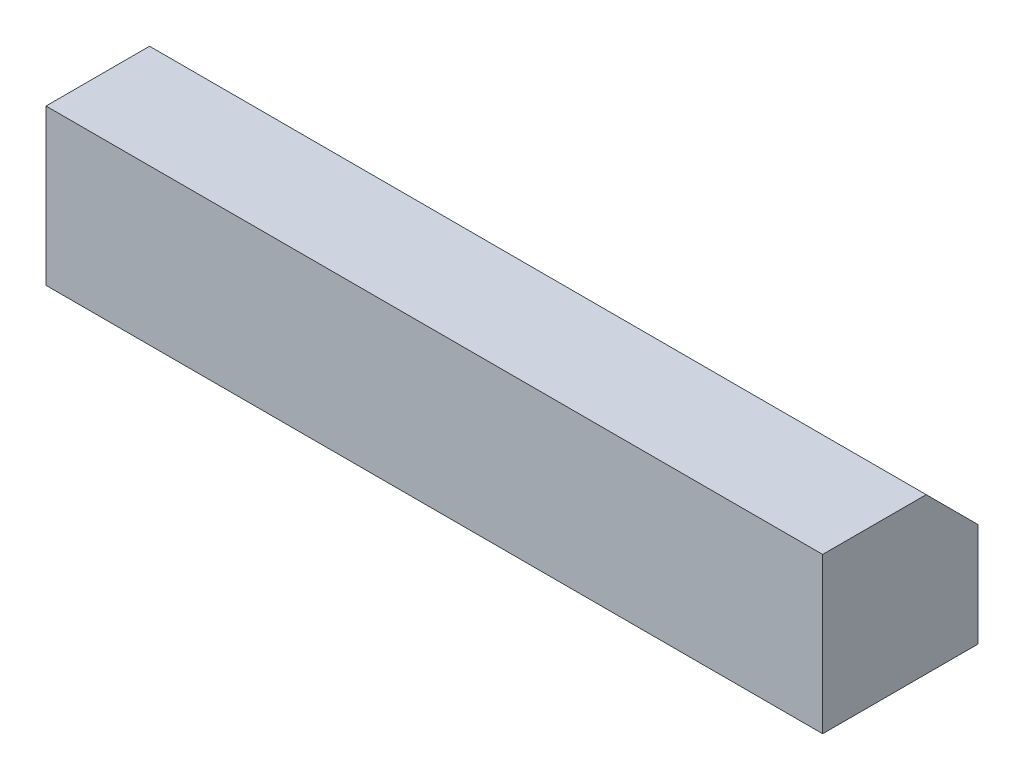
ISO-10303-21;
HEADER;
FILE_DESCRIPTION(('STEP AP214'),'2;1');
FILE_NAME('part.step','',(''),(''),'','','');
FILE_SCHEMA(('AUTOMOTIVE_DESIGN { 1 0 10303 214 1 1 1 1 }'));
ENDSEC;
DATA;
#1=APPLICATION_CONTEXT('core data for automotive mechanical design processes');
#2=APPLICATION_PROTOCOL_DEFINITION('international standard','automotive_design',2000,#1);
#3=PRODUCT_CONTEXT('',#1,'mechanical');
#4=PRODUCT('Part','Part','',(#3));
#5=PRODUCT_RELATED_PRODUCT_CATEGORY('part','',(#4));
#6=PRODUCT_DEFINITION_FORMATION('','',#4);
#7=PRODUCT_DEFINITION_CONTEXT('part definition',#1,'design');
#8=PRODUCT_DEFINITION('design','',#6,#7);
#9=PRODUCT_DEFINITION_SHAPE('','',#8);
#10=(LENGTH_UNIT() NAMED_UNIT(*) SI_UNIT(.MILLI.,.METRE.));
#11=(NAMED_UNIT(*) PLANE_ANGLE_UNIT() SI_UNIT($,.RADIAN.));
#12=(NAMED_UNIT(*) SI_UNIT($,.STERADIAN.) SOLID_ANGLE_UNIT());
#13=UNCERTAINTY_MEASURE_WITH_UNIT(LENGTH_MEASURE(1.E-05),#10,'distance_accuracy_value','');
#14=(GEOMETRIC_REPRESENTATION_CONTEXT(3) GLOBAL_UNCERTAINTY_ASSIGNED_CONTEXT((#13)) GLOBAL_UNIT_ASSIGNED_CONTEXT((#10,
#11,#12)) REPRESENTATION_CONTEXT('',''));
#15=CARTESIAN_POINT('',(0.,0.,0.));
#16=DIRECTION('',(0.,0.,1.));
#17=DIRECTION('',(1.,0.,0.));
#18=AXIS2_PLACEMENT_3D('',#15,#16,#17);
#19=CARTESIAN_POINT('',(7.5,3.,-1.5));
#20=DIRECTION('',(-1.,0.,0.));
#21=DIRECTION('',(0.,0.,1.));
#22=AXIS2_PLACEMENT_3D('',#19,#20,#21);
#23=PLANE('',#22);
#24=DIRECTION('',(0.,-1.,0.));
#25=VECTOR('',#24,1.);
#26=CARTESIAN_POINT('',(7.5,3.,-1.5));
#27=LINE('',#26,#25);
#28=CARTESIAN_POINT('',(7.5,2.,-1.5));
#29=VERTEX_POINT('',#28);
#30=CARTESIAN_POINT('',(7.5,0.,-1.5));
#31=VERTEX_POINT('',#30);
#32=EDGE_CURVE('E134',#29,#31,#27,.T.);
#33=ORIENTED_EDGE('',*,*,#32,.F.);
#34=DIRECTION('',(0.,0.707106781186549,0.707106781186546));
#35=VECTOR('',#34,1.);
#36=CARTESIAN_POINT('',(7.5,3.,-0.5));
#37=LINE('',#36,#35);
#38=CARTESIAN_POINT('',(7.5,3.,-0.5));
#39=VERTEX_POINT('',#38);
#40=EDGE_CURVE('E11',#29,#39,#37,.T.);
#41=ORIENTED_EDGE('',*,*,#40,.T.);
#42=DIRECTION('',(0.,0.,-1.));
#43=VECTOR('',#42,1.);
#44=CARTESIAN_POINT('',(7.5,3.,-1.5));
#45=LINE('',#44,#43);
#46=CARTESIAN_POINT('',(7.5,3.,1.5));
#47=VERTEX_POINT('',#46);
#48=EDGE_CURVE('E97',#47,#39,#45,.T.);
#49=ORIENTED_EDGE('',*,*,#48,.F.);
#50=DIRECTION('',(0.,-1.,0.));
#51=VECTOR('',#50,1.);
#52=CARTESIAN_POINT('',(7.5,3.,1.5));
#53=LINE('',#52,#51);
#54=CARTESIAN_POINT('',(7.5,0.,1.5));
#55=VERTEX_POINT('',#54);
#56=EDGE_CURVE('E108',#47,#55,#53,.T.);
#57=ORIENTED_EDGE('',*,*,#56,.T.);
#58=DIRECTION('',(0.,0.,-1.));
#59=VECTOR('',#58,1.);
#60=CARTESIAN_POINT('',(7.5,0.,-1.5));
#61=LINE('',#60,#59);
#62=EDGE_CURVE('E119',#55,#31,#61,.T.);
#63=ORIENTED_EDGE('',*,*,#62,.T.);
#64=EDGE_LOOP('',(#33,#41,#49,#57,#63));
#65=FACE_BOUND('',#64,.T.);
#66=ADVANCED_FACE('F41',(#65),#23,.F.);
#67=CARTESIAN_POINT('',(-7.5,3.,-1.5));
#68=DIRECTION('',(0.,0.,1.));
#69=DIRECTION('',(1.,0.,0.));
#70=AXIS2_PLACEMENT_3D('',#67,#68,#69);
#71=PLANE('',#70);
#72=DIRECTION('',(0.,-1.,0.));
#73=VECTOR('',#72,1.);
#74=CARTESIAN_POINT('',(-7.5,3.,-1.5));
#75=LINE('',#74,#73);
#76=CARTESIAN_POINT('',(-7.5,2.,-1.5));
#77=VERTEX_POINT('',#76);
#78=CARTESIAN_POINT('',(-7.5,0.,-1.5));
#79=VERTEX_POINT('',#78);
#80=EDGE_CURVE('E107',#77,#79,#75,.T.);
#81=ORIENTED_EDGE('',*,*,#80,.F.);
#82=DIRECTION('',(1.,0.,0.));
#83=VECTOR('',#82,1.);
#84=CARTESIAN_POINT('',(7.5,2.,-1.5));
#85=LINE('',#84,#83);
#86=EDGE_CURVE('E51',#77,#29,#85,.T.);
#87=ORIENTED_EDGE('',*,*,#86,.T.);
#88=ORIENTED_EDGE('',*,*,#32,.T.);
#89=DIRECTION('',(-1.,0.,0.));
#90=VECTOR('',#89,1.);
#91=CARTESIAN_POINT('',(-7.5,0.,-1.5));
#92=LINE('',#91,#90);
#93=EDGE_CURVE('E123',#31,#79,#92,.T.);
#94=ORIENTED_EDGE('',*,*,#93,.T.);
#95=EDGE_LOOP('',(#81,#87,#88,#94));
#96=FACE_BOUND('',#95,.T.);
#97=ADVANCED_FACE('F142',(#96),#71,.F.);
#98=CARTESIAN_POINT('',(-7.5,3.,-1.5));
#99=DIRECTION('',(1.,0.,0.));
#100=DIRECTION('',(0.,0.,-1.));
#101=AXIS2_PLACEMENT_3D('',#98,#99,#100);
#102=PLANE('',#101);
#103=DIRECTION('',(0.,0.,1.));
#104=VECTOR('',#103,1.);
#105=CARTESIAN_POINT('',(-7.5,3.,-1.5));
#106=LINE('',#105,#104);
#107=CARTESIAN_POINT('',(-7.5,3.,-0.5));
#108=VERTEX_POINT('',#107);
#109=CARTESIAN_POINT('',(-7.5,3.,1.5));
#110=VERTEX_POINT('',#109);
#111=EDGE_CURVE('E87',#108,#110,#106,.T.);
#112=ORIENTED_EDGE('',*,*,#111,.F.);
#113=DIRECTION('',(0.,-0.707106781186549,-0.707106781186546));
#114=VECTOR('',#113,1.);
#115=CARTESIAN_POINT('',(-7.5,3.,-0.499999999999999));
#116=LINE('',#115,#114);
#117=EDGE_CURVE('E65',#108,#77,#116,.T.);
#118=ORIENTED_EDGE('',*,*,#117,.T.);
#119=ORIENTED_EDGE('',*,*,#80,.T.);
#120=DIRECTION('',(0.,0.,1.));
#121=VECTOR('',#120,1.);
#122=CARTESIAN_POINT('',(-7.5,0.,-1.5));
#123=LINE('',#122,#121);
#124=CARTESIAN_POINT('',(-7.5,0.,1.5));
#125=VERTEX_POINT('',#124);
#126=EDGE_CURVE('E103',#79,#125,#123,.T.);
#127=ORIENTED_EDGE('',*,*,#126,.T.);
#128=DIRECTION('',(0.,-1.,0.));
#129=VECTOR('',#128,1.);
#130=CARTESIAN_POINT('',(-7.5,3.,1.5));
#131=LINE('',#130,#129);
#132=EDGE_CURVE('E100',#110,#125,#131,.T.);
#133=ORIENTED_EDGE('',*,*,#132,.F.);
#134=EDGE_LOOP('',(#112,#118,#119,#127,#133));
#135=FACE_BOUND('',#134,.T.);
#136=ADVANCED_FACE('F101',(#135),#102,.F.);
#137=CARTESIAN_POINT('',(-7.5,3.,1.5));
#138=DIRECTION('',(0.,0.,-1.));
#139=DIRECTION('',(-1.,0.,0.));
#140=AXIS2_PLACEMENT_3D('',#137,#138,#139);
#141=PLANE('',#140);
#142=DIRECTION('',(1.,0.,0.));
#143=VECTOR('',#142,1.);
#144=CARTESIAN_POINT('',(-7.5,0.,1.5));
#145=LINE('',#144,#143);
#146=EDGE_CURVE('E129',#125,#55,#145,.T.);
#147=ORIENTED_EDGE('',*,*,#146,.T.);
#148=ORIENTED_EDGE('',*,*,#56,.F.);
#149=DIRECTION('',(1.,0.,0.));
#150=VECTOR('',#149,1.);
#151=CARTESIAN_POINT('',(-7.5,3.,1.5));
#152=LINE('',#151,#150);
#153=EDGE_CURVE('E92',#110,#47,#152,.T.);
#154=ORIENTED_EDGE('',*,*,#153,.F.);
#155=ORIENTED_EDGE('',*,*,#132,.T.);
#156=EDGE_LOOP('',(#147,#148,#154,#155));
#157=FACE_BOUND('',#156,.T.);
#158=ADVANCED_FACE('F110',(#157),#141,.F.);
#159=CARTESIAN_POINT('',(0.,3.,0.));
#160=DIRECTION('',(0.,1.,0.));
#161=DIRECTION('',(0.,0.,1.));
#162=AXIS2_PLACEMENT_3D('',#159,#160,#161);
#163=PLANE('',#162);
#164=ORIENTED_EDGE('',*,*,#48,.T.);
#165=DIRECTION('',(-1.,0.,0.));
#166=VECTOR('',#165,1.);
#167=CARTESIAN_POINT('',(-7.5,3.,-0.5));
#168=LINE('',#167,#166);
#169=EDGE_CURVE('E95',#39,#108,#168,.T.);
#170=ORIENTED_EDGE('',*,*,#169,.T.);
#171=ORIENTED_EDGE('',*,*,#111,.T.);
#172=ORIENTED_EDGE('',*,*,#153,.T.);
#173=EDGE_LOOP('',(#164,#170,#171,#172));
#174=FACE_BOUND('',#173,.T.);
#175=ADVANCED_FACE('F90',(#174),#163,.T.);
#176=CARTESIAN_POINT('',(0.,0.,0.));
#177=DIRECTION('',(0.,1.,0.));
#178=DIRECTION('',(0.,0.,1.));
#179=AXIS2_PLACEMENT_3D('',#176,#177,#178);
#180=PLANE('',#179);
#181=ORIENTED_EDGE('',*,*,#62,.F.);
#182=ORIENTED_EDGE('',*,*,#146,.F.);
#183=ORIENTED_EDGE('',*,*,#126,.F.);
#184=ORIENTED_EDGE('',*,*,#93,.F.);
#185=EDGE_LOOP('',(#181,#182,#183,#184));
#186=FACE_BOUND('',#185,.T.);
#187=ADVANCED_FACE('F147',(#186),#180,.F.);
#188=CARTESIAN_POINT('',(0.,3.,-0.5));
#189=DIRECTION('',(0.,0.707106781186546,-0.707106781186549));
#190=DIRECTION('',(1.,0.,0.));
#191=AXIS2_PLACEMENT_3D('',#188,#189,#190);
#192=PLANE('',#191);
#193=ORIENTED_EDGE('',*,*,#40,.F.);
#194=ORIENTED_EDGE('',*,*,#86,.F.);
#195=ORIENTED_EDGE('',*,*,#117,.F.);
#196=ORIENTED_EDGE('',*,*,#169,.F.);
#197=EDGE_LOOP('',(#193,#194,#195,#196));
#198=FACE_BOUND('',#197,.T.);
#199=ADVANCED_FACE('F44',(#198),#192,.T.);
#200=CLOSED_SHELL('',(#66,#97,#136,#158,#175,#187,#199));
#201=MANIFOLD_SOLID_BREP('B2',#200);
#202=ADVANCED_BREP_SHAPE_REPRESENTATION('',(#18,#201),#14);
#203=SHAPE_DEFINITION_REPRESENTATION(#9,#202);
ENDSEC;
END-ISO-10303-21;
